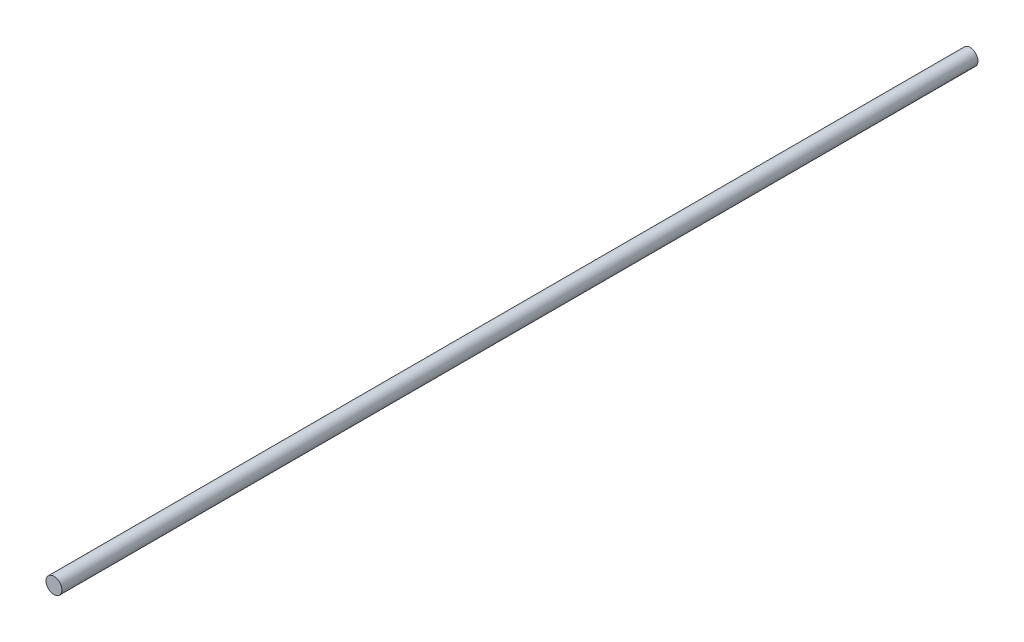
ISO-10303-21;
HEADER;
FILE_DESCRIPTION(('STEP AP214'),'2;1');
FILE_NAME('part.step','',(''),(''),'','','');
FILE_SCHEMA(('AUTOMOTIVE_DESIGN { 1 0 10303 214 1 1 1 1 }'));
ENDSEC;
DATA;
#1=APPLICATION_CONTEXT('core data for automotive mechanical design processes');
#2=APPLICATION_PROTOCOL_DEFINITION('international standard','automotive_design',2000,#1);
#3=PRODUCT_CONTEXT('',#1,'mechanical');
#4=PRODUCT('Part','Part','',(#3));
#5=PRODUCT_RELATED_PRODUCT_CATEGORY('part','',(#4));
#6=PRODUCT_DEFINITION_FORMATION('','',#4);
#7=PRODUCT_DEFINITION_CONTEXT('part definition',#1,'design');
#8=PRODUCT_DEFINITION('design','',#6,#7);
#9=PRODUCT_DEFINITION_SHAPE('','',#8);
#10=(LENGTH_UNIT() NAMED_UNIT(*) SI_UNIT(.MILLI.,.METRE.));
#11=(NAMED_UNIT(*) PLANE_ANGLE_UNIT() SI_UNIT($,.RADIAN.));
#12=(NAMED_UNIT(*) SI_UNIT($,.STERADIAN.) SOLID_ANGLE_UNIT());
#13=UNCERTAINTY_MEASURE_WITH_UNIT(LENGTH_MEASURE(1.E-05),#10,'distance_accuracy_value','');
#14=(GEOMETRIC_REPRESENTATION_CONTEXT(3) GLOBAL_UNCERTAINTY_ASSIGNED_CONTEXT((#13)) GLOBAL_UNIT_ASSIGNED_CONTEXT((#10,
#11,#12)) REPRESENTATION_CONTEXT('',''));
#15=CARTESIAN_POINT('',(0.,0.,0.));
#16=DIRECTION('',(0.,0.,1.));
#17=DIRECTION('',(1.,0.,0.));
#18=AXIS2_PLACEMENT_3D('',#15,#16,#17);
#19=CARTESIAN_POINT('',(0.,0.,173.));
#20=DIRECTION('',(0.,0.,-1.));
#21=DIRECTION('',(-1.,0.,0.));
#22=AXIS2_PLACEMENT_3D('',#19,#20,#21);
#23=CYLINDRICAL_SURFACE('',#22,1.5);
#24=CARTESIAN_POINT('',(0.,0.,173.));
#25=DIRECTION('',(0.,0.,1.));
#26=DIRECTION('',(1.,0.,0.));
#27=AXIS2_PLACEMENT_3D('',#24,#25,#26);
#28=CIRCLE('',#27,1.5);
#29=CARTESIAN_POINT('',(1.5,0.,173.));
#30=VERTEX_POINT('',#29);
#31=EDGE_CURVE('E10',#30,#30,#28,.T.);
#32=ORIENTED_EDGE('',*,*,#31,.F.);
#33=EDGE_LOOP('',(#32));
#34=FACE_BOUND('',#33,.T.);
#35=CARTESIAN_POINT('',(0.,0.,0.));
#36=DIRECTION('',(0.,0.,1.));
#37=DIRECTION('',(1.,0.,0.));
#38=AXIS2_PLACEMENT_3D('',#35,#36,#37);
#39=CIRCLE('',#38,1.5);
#40=CARTESIAN_POINT('',(1.5,0.,0.));
#41=VERTEX_POINT('',#40);
#42=EDGE_CURVE('E33',#41,#41,#39,.T.);
#43=ORIENTED_EDGE('',*,*,#42,.T.);
#44=EDGE_LOOP('',(#43));
#45=FACE_BOUND('',#44,.T.);
#46=ADVANCED_FACE('F30',(#34,#45),#23,.T.);
#47=CARTESIAN_POINT('',(0.,0.,173.));
#48=DIRECTION('',(0.,0.,1.));
#49=DIRECTION('',(1.,0.,0.));
#50=AXIS2_PLACEMENT_3D('',#47,#48,#49);
#51=PLANE('',#50);
#52=ORIENTED_EDGE('',*,*,#31,.T.);
#53=EDGE_LOOP('',(#52));
#54=FACE_BOUND('',#53,.T.);
#55=ADVANCED_FACE('F45',(#54),#51,.T.);
#56=CARTESIAN_POINT('',(0.,0.,0.));
#57=DIRECTION('',(0.,0.,1.));
#58=DIRECTION('',(1.,0.,0.));
#59=AXIS2_PLACEMENT_3D('',#56,#57,#58);
#60=PLANE('',#59);
#61=ORIENTED_EDGE('',*,*,#42,.F.);
#62=EDGE_LOOP('',(#61));
#63=FACE_BOUND('',#62,.T.);
#64=ADVANCED_FACE('F43',(#63),#60,.F.);
#65=CLOSED_SHELL('',(#46,#55,#64));
#66=MANIFOLD_SOLID_BREP('B2',#65);
#67=ADVANCED_BREP_SHAPE_REPRESENTATION('',(#18,#66),#14);
#68=SHAPE_DEFINITION_REPRESENTATION(#9,#67);
ENDSEC;
END-ISO-10303-21;
